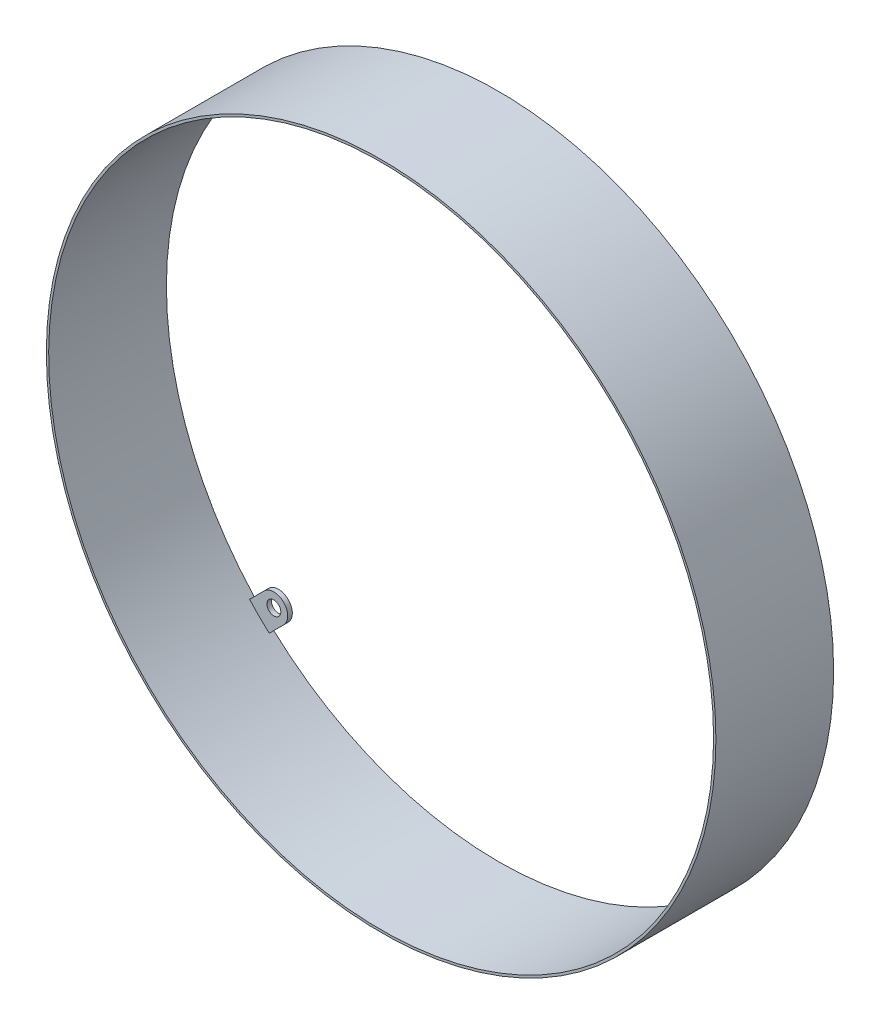
ISO-10303-21;
HEADER;
FILE_DESCRIPTION(('STEP AP214'),'2;1');
FILE_NAME('part.step','',(''),(''),'','','');
FILE_SCHEMA(('AUTOMOTIVE_DESIGN { 1 0 10303 214 1 1 1 1 }'));
ENDSEC;
DATA;
#1=APPLICATION_CONTEXT('core data for automotive mechanical design processes');
#2=APPLICATION_PROTOCOL_DEFINITION('international standard','automotive_design',2000,#1);
#3=PRODUCT_CONTEXT('',#1,'mechanical');
#4=PRODUCT('Part','Part','',(#3));
#5=PRODUCT_RELATED_PRODUCT_CATEGORY('part','',(#4));
#6=PRODUCT_DEFINITION_FORMATION('','',#4);
#7=PRODUCT_DEFINITION_CONTEXT('part definition',#1,'design');
#8=PRODUCT_DEFINITION('design','',#6,#7);
#9=PRODUCT_DEFINITION_SHAPE('','',#8);
#10=(LENGTH_UNIT() NAMED_UNIT(*) SI_UNIT(.MILLI.,.METRE.));
#11=(NAMED_UNIT(*) PLANE_ANGLE_UNIT() SI_UNIT($,.RADIAN.));
#12=(NAMED_UNIT(*) SI_UNIT($,.STERADIAN.) SOLID_ANGLE_UNIT());
#13=UNCERTAINTY_MEASURE_WITH_UNIT(LENGTH_MEASURE(1.E-05),#10,'distance_accuracy_value','');
#14=(GEOMETRIC_REPRESENTATION_CONTEXT(3) GLOBAL_UNCERTAINTY_ASSIGNED_CONTEXT((#13)) GLOBAL_UNIT_ASSIGNED_CONTEXT((#10,
#11,#12)) REPRESENTATION_CONTEXT('',''));
#15=CARTESIAN_POINT('',(0.,0.,0.));
#16=DIRECTION('',(0.,0.,1.));
#17=DIRECTION('',(1.,0.,0.));
#18=AXIS2_PLACEMENT_3D('',#15,#16,#17);
#19=CARTESIAN_POINT('',(0.,0.,25.5));
#20=DIRECTION('',(0.,0.,-1.));
#21=DIRECTION('',(-1.,0.,0.));
#22=AXIS2_PLACEMENT_3D('',#19,#20,#21);
#23=CYLINDRICAL_SURFACE('',#22,72.);
#24=CARTESIAN_POINT('',(0.,0.,25.5));
#25=DIRECTION('',(0.,0.,1.));
#26=DIRECTION('',(1.,0.,0.));
#27=AXIS2_PLACEMENT_3D('',#24,#25,#26);
#28=CIRCLE('',#27,72.);
#29=CARTESIAN_POINT('',(72.,0.,25.5));
#30=VERTEX_POINT('',#29);
#31=EDGE_CURVE('E285',#30,#30,#28,.T.);
#32=ORIENTED_EDGE('',*,*,#31,.T.);
#33=EDGE_LOOP('',(#32));
#34=FACE_BOUND('',#33,.T.);
#35=CARTESIAN_POINT('',(0.,0.,1.));
#36=DIRECTION('',(0.,0.,1.));
#37=DIRECTION('',(1.,0.,0.));
#38=AXIS2_PLACEMENT_3D('',#35,#36,#37);
#39=CIRCLE('',#38,72.);
#40=CARTESIAN_POINT('',(48.7461545298805,-52.9887952169985,1.));
#41=VERTEX_POINT('',#40);
#42=CARTESIAN_POINT('',(52.9887952169998,-48.7461545298792,1.));
#43=VERTEX_POINT('',#42);
#44=EDGE_CURVE('E13',#41,#43,#39,.T.);
#45=ORIENTED_EDGE('',*,*,#44,.F.);
#46=DIRECTION('',(0.,0.,-1.));
#47=VECTOR('',#46,1.);
#48=CARTESIAN_POINT('',(48.7461545298805,-52.9887952169985,25.5));
#49=LINE('',#48,#47);
#50=CARTESIAN_POINT('',(48.7461545298805,-52.9887952169985,0.));
#51=VERTEX_POINT('',#50);
#52=EDGE_CURVE('E169',#41,#51,#49,.T.);
#53=ORIENTED_EDGE('',*,*,#52,.T.);
#54=CARTESIAN_POINT('',(0.,0.,0.));
#55=DIRECTION('',(0.,0.,1.));
#56=DIRECTION('',(1.,0.,0.));
#57=AXIS2_PLACEMENT_3D('',#54,#55,#56);
#58=CIRCLE('',#57,72.);
#59=CARTESIAN_POINT('',(-48.7461545298798,-52.9887952169992,0.));
#60=VERTEX_POINT('',#59);
#61=EDGE_CURVE('E317',#60,#51,#58,.T.);
#62=ORIENTED_EDGE('',*,*,#61,.F.);
#63=DIRECTION('',(0.,0.,-1.));
#64=VECTOR('',#63,1.);
#65=CARTESIAN_POINT('',(-48.7461545298798,-52.9887952169992,25.5));
#66=LINE('',#65,#64);
#67=CARTESIAN_POINT('',(-48.7461545298798,-52.9887952169992,1.));
#68=VERTEX_POINT('',#67);
#69=EDGE_CURVE('E218',#68,#60,#66,.T.);
#70=ORIENTED_EDGE('',*,*,#69,.F.);
#71=CARTESIAN_POINT('',(0.,0.,1.));
#72=DIRECTION('',(0.,0.,1.));
#73=DIRECTION('',(1.,0.,0.));
#74=AXIS2_PLACEMENT_3D('',#71,#72,#73);
#75=CIRCLE('',#74,72.);
#76=CARTESIAN_POINT('',(-52.9887952169991,-48.74615452988,1.));
#77=VERTEX_POINT('',#76);
#78=EDGE_CURVE('E55',#77,#68,#75,.T.);
#79=ORIENTED_EDGE('',*,*,#78,.F.);
#80=DIRECTION('',(0.,0.,-1.));
#81=VECTOR('',#80,1.);
#82=CARTESIAN_POINT('',(-52.9887952169991,-48.74615452988,25.5));
#83=LINE('',#82,#81);
#84=CARTESIAN_POINT('',(-52.9887952169991,-48.74615452988,0.));
#85=VERTEX_POINT('',#84);
#86=EDGE_CURVE('E220',#77,#85,#83,.T.);
#87=ORIENTED_EDGE('',*,*,#86,.T.);
#88=CARTESIAN_POINT('',(-52.9887952169994,48.7461545298796,0.));
#89=VERTEX_POINT('',#88);
#90=EDGE_CURVE('E292',#89,#85,#58,.T.);
#91=ORIENTED_EDGE('',*,*,#90,.F.);
#92=DIRECTION('',(0.,0.,-1.));
#93=VECTOR('',#92,1.);
#94=CARTESIAN_POINT('',(-52.9887952169994,48.7461545298796,25.5));
#95=LINE('',#94,#93);
#96=CARTESIAN_POINT('',(-52.9887952169994,48.7461545298796,1.));
#97=VERTEX_POINT('',#96);
#98=EDGE_CURVE('E250',#97,#89,#95,.T.);
#99=ORIENTED_EDGE('',*,*,#98,.F.);
#100=CARTESIAN_POINT('',(0.,0.,1.));
#101=DIRECTION('',(0.,0.,1.));
#102=DIRECTION('',(1.,0.,0.));
#103=AXIS2_PLACEMENT_3D('',#100,#101,#102);
#104=CIRCLE('',#103,72.);
#105=CARTESIAN_POINT('',(-48.7461545298802,52.9887952169989,1.));
#106=VERTEX_POINT('',#105);
#107=EDGE_CURVE('E306',#106,#97,#104,.T.);
#108=ORIENTED_EDGE('',*,*,#107,.F.);
#109=DIRECTION('',(0.,0.,-1.));
#110=VECTOR('',#109,1.);
#111=CARTESIAN_POINT('',(-48.7461545298802,52.9887952169989,25.5));
#112=LINE('',#111,#110);
#113=CARTESIAN_POINT('',(-48.7461545298802,52.9887952169989,0.));
#114=VERTEX_POINT('',#113);
#115=EDGE_CURVE('E253',#106,#114,#112,.T.);
#116=ORIENTED_EDGE('',*,*,#115,.T.);
#117=CARTESIAN_POINT('',(48.7461545298798,52.9887952169992,0.));
#118=VERTEX_POINT('',#117);
#119=EDGE_CURVE('E289',#118,#114,#58,.T.);
#120=ORIENTED_EDGE('',*,*,#119,.F.);
#121=DIRECTION('',(0.,0.,-1.));
#122=VECTOR('',#121,1.);
#123=CARTESIAN_POINT('',(48.7461545298798,52.9887952169992,25.5));
#124=LINE('',#123,#122);
#125=CARTESIAN_POINT('',(48.7461545298798,52.9887952169992,1.));
#126=VERTEX_POINT('',#125);
#127=EDGE_CURVE('E300',#126,#118,#124,.T.);
#128=ORIENTED_EDGE('',*,*,#127,.F.);
#129=CARTESIAN_POINT('',(0.,0.,1.));
#130=DIRECTION('',(0.,0.,1.));
#131=DIRECTION('',(1.,0.,0.));
#132=AXIS2_PLACEMENT_3D('',#129,#130,#131);
#133=CIRCLE('',#132,72.);
#134=CARTESIAN_POINT('',(52.9887952169991,48.74615452988,1.));
#135=VERTEX_POINT('',#134);
#136=EDGE_CURVE('E296',#135,#126,#133,.T.);
#137=ORIENTED_EDGE('',*,*,#136,.F.);
#138=DIRECTION('',(0.,0.,-1.));
#139=VECTOR('',#138,1.);
#140=CARTESIAN_POINT('',(52.9887952169991,48.74615452988,25.5));
#141=LINE('',#140,#139);
#142=CARTESIAN_POINT('',(52.9887952169991,48.74615452988,0.));
#143=VERTEX_POINT('',#142);
#144=EDGE_CURVE('E303',#135,#143,#141,.T.);
#145=ORIENTED_EDGE('',*,*,#144,.T.);
#146=CARTESIAN_POINT('',(52.9887952169998,-48.7461545298792,0.));
#147=VERTEX_POINT('',#146);
#148=EDGE_CURVE('E284',#147,#143,#58,.T.);
#149=ORIENTED_EDGE('',*,*,#148,.F.);
#150=DIRECTION('',(0.,0.,-1.));
#151=VECTOR('',#150,1.);
#152=CARTESIAN_POINT('',(52.9887952169998,-48.7461545298792,25.5));
#153=LINE('',#152,#151);
#154=EDGE_CURVE('E183',#43,#147,#153,.T.);
#155=ORIENTED_EDGE('',*,*,#154,.F.);
#156=EDGE_LOOP('',(#45,#53,#62,#70,#79,#87,#91,#99,#108,#116,#120,#128,#137,#145,#149,#155));
#157=FACE_BOUND('',#156,.T.);
#158=ADVANCED_FACE('F47',(#34,#157),#23,.F.);
#159=CARTESIAN_POINT('',(0.,0.,25.5));
#160=DIRECTION('',(0.,0.,1.));
#161=DIRECTION('',(1.,0.,0.));
#162=AXIS2_PLACEMENT_3D('',#159,#160,#161);
#163=PLANE('',#162);
#164=CARTESIAN_POINT('',(0.,0.,25.5));
#165=DIRECTION('',(0.,0.,1.));
#166=DIRECTION('',(1.,0.,0.));
#167=AXIS2_PLACEMENT_3D('',#164,#165,#166);
#168=CIRCLE('',#167,72.5);
#169=CARTESIAN_POINT('',(72.5,0.,25.5));
#170=VERTEX_POINT('',#169);
#171=EDGE_CURVE('E293',#170,#170,#168,.T.);
#172=ORIENTED_EDGE('',*,*,#171,.T.);
#173=EDGE_LOOP('',(#172));
#174=FACE_BOUND('',#173,.T.);
#175=ORIENTED_EDGE('',*,*,#31,.F.);
#176=EDGE_LOOP('',(#175));
#177=FACE_BOUND('',#176,.T.);
#178=ADVANCED_FACE('F372',(#174,#177),#163,.T.);
#179=CARTESIAN_POINT('',(0.,0.,0.));
#180=DIRECTION('',(0.,0.,1.));
#181=DIRECTION('',(1.,0.,0.));
#182=AXIS2_PLACEMENT_3D('',#179,#180,#181);
#183=PLANE('',#182);
#184=ORIENTED_EDGE('',*,*,#61,.T.);
#185=DIRECTION('',(0.707106781186558,-0.707106781186537,0.));
#186=VECTOR('',#185,1.);
#187=CARTESIAN_POINT('',(-2.12132034355973,-2.12132034355979,0.));
#188=LINE('',#187,#186);
#189=CARTESIAN_POINT('',(45.6083873865329,-49.851028073651,0.));
#190=VERTEX_POINT('',#189);
#191=EDGE_CURVE('E404',#190,#51,#188,.T.);
#192=ORIENTED_EDGE('',*,*,#191,.F.);
#193=CARTESIAN_POINT('',(47.7297077300926,-47.7297077300914,0.));
#194=DIRECTION('',(0.,0.,1.));
#195=DIRECTION('',(0.,-1.,0.));
#196=AXIS2_PLACEMENT_3D('',#193,#194,#195);
#197=CIRCLE('',#196,3.);
#198=CARTESIAN_POINT('',(49.8510280736522,-45.6083873865317,0.));
#199=VERTEX_POINT('',#198);
#200=EDGE_CURVE('E182',#199,#190,#197,.T.);
#201=ORIENTED_EDGE('',*,*,#200,.F.);
#202=DIRECTION('',(0.707106781186556,-0.707106781186539,0.));
#203=VECTOR('',#202,1.);
#204=CARTESIAN_POINT('',(2.12132034355965,2.1213203435597,0.));
#205=LINE('',#204,#203);
#206=EDGE_CURVE('E62',#199,#147,#205,.T.);
#207=ORIENTED_EDGE('',*,*,#206,.T.);
#208=ORIENTED_EDGE('',*,*,#148,.T.);
#209=DIRECTION('',(0.707106781186544,0.707106781186551,0.));
#210=VECTOR('',#209,1.);
#211=CARTESIAN_POINT('',(2.12132034355977,-2.12132034355975,0.));
#212=LINE('',#211,#210);
#213=CARTESIAN_POINT('',(49.8510280736515,45.6083873865324,0.));
#214=VERTEX_POINT('',#213);
#215=EDGE_CURVE('E273',#214,#143,#212,.T.);
#216=ORIENTED_EDGE('',*,*,#215,.F.);
#217=CARTESIAN_POINT('',(47.7297077300919,47.7297077300921,0.));
#218=DIRECTION('',(0.,0.,1.));
#219=DIRECTION('',(1.,0.,0.));
#220=AXIS2_PLACEMENT_3D('',#217,#218,#219);
#221=CIRCLE('',#220,3.);
#222=CARTESIAN_POINT('',(45.6083873865322,49.8510280736517,0.));
#223=VERTEX_POINT('',#222);
#224=EDGE_CURVE('E256',#223,#214,#221,.T.);
#225=ORIENTED_EDGE('',*,*,#224,.F.);
#226=DIRECTION('',(0.707106781186547,0.707106781186548,0.));
#227=VECTOR('',#226,1.);
#228=CARTESIAN_POINT('',(-2.12132034355968,2.12132034355968,0.));
#229=LINE('',#228,#227);
#230=EDGE_CURVE('E276',#223,#118,#229,.T.);
#231=ORIENTED_EDGE('',*,*,#230,.T.);
#232=ORIENTED_EDGE('',*,*,#119,.T.);
#233=DIRECTION('',(-0.707106781186553,0.707106781186542,0.));
#234=VECTOR('',#233,1.);
#235=CARTESIAN_POINT('',(2.12132034355975,2.12132034355978,0.));
#236=LINE('',#235,#234);
#237=CARTESIAN_POINT('',(-45.6083873865326,49.8510280736514,0.));
#238=VERTEX_POINT('',#237);
#239=EDGE_CURVE('E240',#238,#114,#236,.T.);
#240=ORIENTED_EDGE('',*,*,#239,.F.);
#241=CARTESIAN_POINT('',(-47.7297077300922,47.7297077300917,0.));
#242=DIRECTION('',(0.,0.,1.));
#243=DIRECTION('',(0.,1.,0.));
#244=AXIS2_PLACEMENT_3D('',#241,#242,#243);
#245=CIRCLE('',#244,3.);
#246=CARTESIAN_POINT('',(-49.8510280736518,45.608387386532,0.));
#247=VERTEX_POINT('',#246);
#248=EDGE_CURVE('E223',#247,#238,#245,.T.);
#249=ORIENTED_EDGE('',*,*,#248,.F.);
#250=DIRECTION('',(-0.707106781186551,0.707106781186544,0.));
#251=VECTOR('',#250,1.);
#252=CARTESIAN_POINT('',(-2.12132034355967,-2.12132034355969,0.));
#253=LINE('',#252,#251);
#254=EDGE_CURVE('E242',#247,#89,#253,.T.);
#255=ORIENTED_EDGE('',*,*,#254,.T.);
#256=ORIENTED_EDGE('',*,*,#90,.T.);
#257=DIRECTION('',(-0.707106781186544,-0.707106781186551,0.));
#258=VECTOR('',#257,1.);
#259=CARTESIAN_POINT('',(-2.12132034355977,2.12132034355975,0.));
#260=LINE('',#259,#258);
#261=CARTESIAN_POINT('',(-49.8510280736515,-45.6083873865324,0.));
#262=VERTEX_POINT('',#261);
#263=EDGE_CURVE('E209',#262,#85,#260,.T.);
#264=ORIENTED_EDGE('',*,*,#263,.F.);
#265=CARTESIAN_POINT('',(-47.7297077300919,-47.7297077300921,0.));
#266=DIRECTION('',(0.,0.,1.));
#267=DIRECTION('',(-1.,0.,0.));
#268=AXIS2_PLACEMENT_3D('',#265,#266,#267);
#269=CIRCLE('',#268,3.);
#270=CARTESIAN_POINT('',(-45.6083873865322,-49.8510280736517,0.));
#271=VERTEX_POINT('',#270);
#272=EDGE_CURVE('E192',#271,#262,#269,.T.);
#273=ORIENTED_EDGE('',*,*,#272,.F.);
#274=DIRECTION('',(-0.707106781186547,-0.707106781186548,0.));
#275=VECTOR('',#274,1.);
#276=CARTESIAN_POINT('',(2.12132034355968,-2.12132034355968,0.));
#277=LINE('',#276,#275);
#278=EDGE_CURVE('E69',#271,#60,#277,.T.);
#279=ORIENTED_EDGE('',*,*,#278,.T.);
#280=EDGE_LOOP('',(#184,#192,#201,#207,#208,#216,#225,#231,#232,#240,#249,#255,#256,#264,#273,#279));
#281=FACE_BOUND('',#280,.T.);
#282=CARTESIAN_POINT('',(-47.7297077300919,-47.7297077300921,0.));
#283=DIRECTION('',(0.,0.,1.));
#284=DIRECTION('',(-1.,0.,0.));
#285=AXIS2_PLACEMENT_3D('',#282,#283,#284);
#286=CIRCLE('',#285,1.5);
#287=CARTESIAN_POINT('',(-49.2297077300919,-47.7297077300921,0.));
#288=VERTEX_POINT('',#287);
#289=EDGE_CURVE('E197',#288,#288,#286,.T.);
#290=ORIENTED_EDGE('',*,*,#289,.T.);
#291=EDGE_LOOP('',(#290));
#292=FACE_BOUND('',#291,.T.);
#293=CARTESIAN_POINT('',(0.,0.,0.));
#294=DIRECTION('',(0.,0.,1.));
#295=DIRECTION('',(1.,0.,0.));
#296=AXIS2_PLACEMENT_3D('',#293,#294,#295);
#297=CIRCLE('',#296,72.5);
#298=CARTESIAN_POINT('',(72.5,0.,0.));
#299=VERTEX_POINT('',#298);
#300=EDGE_CURVE('E288',#299,#299,#297,.T.);
#301=ORIENTED_EDGE('',*,*,#300,.F.);
#302=EDGE_LOOP('',(#301));
#303=FACE_BOUND('',#302,.T.);
#304=CARTESIAN_POINT('',(47.7297077300919,47.7297077300921,0.));
#305=DIRECTION('',(0.,0.,1.));
#306=DIRECTION('',(1.,0.,0.));
#307=AXIS2_PLACEMENT_3D('',#304,#305,#306);
#308=CIRCLE('',#307,1.5);
#309=CARTESIAN_POINT('',(49.2297077300919,47.7297077300921,0.));
#310=VERTEX_POINT('',#309);
#311=EDGE_CURVE('E261',#310,#310,#308,.T.);
#312=ORIENTED_EDGE('',*,*,#311,.T.);
#313=EDGE_LOOP('',(#312));
#314=FACE_BOUND('',#313,.T.);
#315=CARTESIAN_POINT('',(-47.7297077300922,47.7297077300917,0.));
#316=DIRECTION('',(0.,0.,1.));
#317=DIRECTION('',(0.,1.,0.));
#318=AXIS2_PLACEMENT_3D('',#315,#316,#317);
#319=CIRCLE('',#318,1.5);
#320=CARTESIAN_POINT('',(-47.7297077300922,49.2297077300917,0.));
#321=VERTEX_POINT('',#320);
#322=EDGE_CURVE('E228',#321,#321,#319,.T.);
#323=ORIENTED_EDGE('',*,*,#322,.T.);
#324=EDGE_LOOP('',(#323));
#325=FACE_BOUND('',#324,.T.);
#326=CARTESIAN_POINT('',(47.7297077300926,-47.7297077300914,0.));
#327=DIRECTION('',(0.,0.,1.));
#328=DIRECTION('',(0.,-1.,0.));
#329=AXIS2_PLACEMENT_3D('',#326,#327,#328);
#330=CIRCLE('',#329,1.5);
#331=CARTESIAN_POINT('',(47.7297077300926,-49.2297077300914,0.));
#332=VERTEX_POINT('',#331);
#333=EDGE_CURVE('E179',#332,#332,#330,.T.);
#334=ORIENTED_EDGE('',*,*,#333,.T.);
#335=EDGE_LOOP('',(#334));
#336=FACE_BOUND('',#335,.T.);
#337=ADVANCED_FACE('F320',(#281,#292,#303,#314,#325,#336),#183,.F.);
#338=CARTESIAN_POINT('',(0.,0.,25.5));
#339=DIRECTION('',(0.,0.,-1.));
#340=DIRECTION('',(-1.,0.,0.));
#341=AXIS2_PLACEMENT_3D('',#338,#339,#340);
#342=CYLINDRICAL_SURFACE('',#341,72.5);
#343=ORIENTED_EDGE('',*,*,#171,.F.);
#344=EDGE_LOOP('',(#343));
#345=FACE_BOUND('',#344,.T.);
#346=ORIENTED_EDGE('',*,*,#300,.T.);
#347=EDGE_LOOP('',(#346));
#348=FACE_BOUND('',#347,.T.);
#349=ADVANCED_FACE('F49',(#345,#348),#342,.T.);
#350=CARTESIAN_POINT('',(0.,0.,1.));
#351=DIRECTION('',(0.,0.,1.));
#352=DIRECTION('',(1.,0.,0.));
#353=AXIS2_PLACEMENT_3D('',#350,#351,#352);
#354=PLANE('',#353);
#355=CARTESIAN_POINT('',(47.7297077300919,47.7297077300921,1.));
#356=DIRECTION('',(0.,0.,1.));
#357=DIRECTION('',(1.,0.,0.));
#358=AXIS2_PLACEMENT_3D('',#355,#356,#357);
#359=CIRCLE('',#358,1.5);
#360=CARTESIAN_POINT('',(49.2297077300919,47.7297077300921,1.));
#361=VERTEX_POINT('',#360);
#362=EDGE_CURVE('E267',#361,#361,#359,.T.);
#363=ORIENTED_EDGE('',*,*,#362,.F.);
#364=EDGE_LOOP('',(#363));
#365=FACE_BOUND('',#364,.T.);
#366=DIRECTION('',(0.707106781186544,0.707106781186551,0.));
#367=VECTOR('',#366,1.);
#368=CARTESIAN_POINT('',(2.12132034355977,-2.12132034355975,1.));
#369=LINE('',#368,#367);
#370=CARTESIAN_POINT('',(49.8510280736515,45.6083873865324,1.));
#371=VERTEX_POINT('',#370);
#372=EDGE_CURVE('E260',#371,#135,#369,.T.);
#373=ORIENTED_EDGE('',*,*,#372,.T.);
#374=ORIENTED_EDGE('',*,*,#136,.T.);
#375=DIRECTION('',(0.707106781186547,0.707106781186548,0.));
#376=VECTOR('',#375,1.);
#377=CARTESIAN_POINT('',(-2.12132034355968,2.12132034355968,1.));
#378=LINE('',#377,#376);
#379=CARTESIAN_POINT('',(45.6083873865322,49.8510280736517,1.));
#380=VERTEX_POINT('',#379);
#381=EDGE_CURVE('E264',#380,#126,#378,.T.);
#382=ORIENTED_EDGE('',*,*,#381,.F.);
#383=CARTESIAN_POINT('',(47.7297077300919,47.7297077300921,1.));
#384=DIRECTION('',(0.,0.,1.));
#385=DIRECTION('',(1.,0.,0.));
#386=AXIS2_PLACEMENT_3D('',#383,#384,#385);
#387=CIRCLE('',#386,3.);
#388=EDGE_CURVE('E257',#380,#371,#387,.T.);
#389=ORIENTED_EDGE('',*,*,#388,.T.);
#390=EDGE_LOOP('',(#373,#374,#382,#389));
#391=FACE_BOUND('',#390,.T.);
#392=ADVANCED_FACE('F332',(#365,#391),#354,.T.);
#393=CARTESIAN_POINT('',(47.7297077300919,47.7297077300921,1.));
#394=DIRECTION('',(0.,0.,-1.));
#395=DIRECTION('',(-1.,0.,0.));
#396=AXIS2_PLACEMENT_3D('',#393,#394,#395);
#397=CYLINDRICAL_SURFACE('',#396,3.);
#398=ORIENTED_EDGE('',*,*,#224,.T.);
#399=DIRECTION('',(0.,0.,-1.));
#400=VECTOR('',#399,1.);
#401=CARTESIAN_POINT('',(49.8510280736515,45.6083873865324,1.));
#402=LINE('',#401,#400);
#403=EDGE_CURVE('E281',#371,#214,#402,.T.);
#404=ORIENTED_EDGE('',*,*,#403,.F.);
#405=ORIENTED_EDGE('',*,*,#388,.F.);
#406=DIRECTION('',(0.,0.,-1.));
#407=VECTOR('',#406,1.);
#408=CARTESIAN_POINT('',(45.6083873865322,49.8510280736517,1.));
#409=LINE('',#408,#407);
#410=EDGE_CURVE('E270',#380,#223,#409,.T.);
#411=ORIENTED_EDGE('',*,*,#410,.T.);
#412=EDGE_LOOP('',(#398,#404,#405,#411));
#413=FACE_BOUND('',#412,.T.);
#414=ADVANCED_FACE('F338',(#413),#397,.T.);
#415=CARTESIAN_POINT('',(2.12132034355977,-2.12132034355975,1.));
#416=DIRECTION('',(-0.707106781186551,0.707106781186544,0.));
#417=DIRECTION('',(-0.707106781186544,-0.707106781186551,0.));
#418=AXIS2_PLACEMENT_3D('',#415,#416,#417);
#419=PLANE('',#418);
#420=ORIENTED_EDGE('',*,*,#144,.F.);
#421=ORIENTED_EDGE('',*,*,#372,.F.);
#422=ORIENTED_EDGE('',*,*,#403,.T.);
#423=ORIENTED_EDGE('',*,*,#215,.T.);
#424=EDGE_LOOP('',(#420,#421,#422,#423));
#425=FACE_BOUND('',#424,.T.);
#426=ADVANCED_FACE('F326',(#425),#419,.F.);
#427=CARTESIAN_POINT('',(-2.12132034355968,2.12132034355968,1.));
#428=DIRECTION('',(-0.707106781186548,0.707106781186547,0.));
#429=DIRECTION('',(-0.707106781186547,-0.707106781186548,0.));
#430=AXIS2_PLACEMENT_3D('',#427,#428,#429);
#431=PLANE('',#430);
#432=ORIENTED_EDGE('',*,*,#381,.T.);
#433=ORIENTED_EDGE('',*,*,#127,.T.);
#434=ORIENTED_EDGE('',*,*,#230,.F.);
#435=ORIENTED_EDGE('',*,*,#410,.F.);
#436=EDGE_LOOP('',(#432,#433,#434,#435));
#437=FACE_BOUND('',#436,.T.);
#438=ADVANCED_FACE('F334',(#437),#431,.T.);
#439=CARTESIAN_POINT('',(47.7297077300919,47.7297077300921,1.));
#440=DIRECTION('',(0.,0.,-1.));
#441=DIRECTION('',(-1.,0.,0.));
#442=AXIS2_PLACEMENT_3D('',#439,#440,#441);
#443=CYLINDRICAL_SURFACE('',#442,1.5);
#444=ORIENTED_EDGE('',*,*,#362,.T.);
#445=EDGE_LOOP('',(#444));
#446=FACE_BOUND('',#445,.T.);
#447=ORIENTED_EDGE('',*,*,#311,.F.);
#448=EDGE_LOOP('',(#447));
#449=FACE_BOUND('',#448,.T.);
#450=ADVANCED_FACE('F533',(#446,#449),#443,.F.);
#451=CARTESIAN_POINT('',(0.,0.,1.));
#452=DIRECTION('',(0.,0.,1.));
#453=DIRECTION('',(0.,1.,0.));
#454=AXIS2_PLACEMENT_3D('',#451,#452,#453);
#455=PLANE('',#454);
#456=CARTESIAN_POINT('',(-47.7297077300922,47.7297077300917,1.));
#457=DIRECTION('',(0.,0.,1.));
#458=DIRECTION('',(0.,1.,0.));
#459=AXIS2_PLACEMENT_3D('',#456,#457,#458);
#460=CIRCLE('',#459,1.5);
#461=CARTESIAN_POINT('',(-47.7297077300922,49.2297077300917,1.));
#462=VERTEX_POINT('',#461);
#463=EDGE_CURVE('E234',#462,#462,#460,.T.);
#464=ORIENTED_EDGE('',*,*,#463,.F.);
#465=EDGE_LOOP('',(#464));
#466=FACE_BOUND('',#465,.T.);
#467=DIRECTION('',(-0.707106781186553,0.707106781186542,0.));
#468=VECTOR('',#467,1.);
#469=CARTESIAN_POINT('',(2.12132034355975,2.12132034355978,1.));
#470=LINE('',#469,#468);
#471=CARTESIAN_POINT('',(-45.6083873865326,49.8510280736514,1.));
#472=VERTEX_POINT('',#471);
#473=EDGE_CURVE('E227',#472,#106,#470,.T.);
#474=ORIENTED_EDGE('',*,*,#473,.T.);
#475=ORIENTED_EDGE('',*,*,#107,.T.);
#476=DIRECTION('',(-0.707106781186551,0.707106781186544,0.));
#477=VECTOR('',#476,1.);
#478=CARTESIAN_POINT('',(-2.12132034355967,-2.12132034355969,1.));
#479=LINE('',#478,#477);
#480=CARTESIAN_POINT('',(-49.8510280736518,45.608387386532,1.));
#481=VERTEX_POINT('',#480);
#482=EDGE_CURVE('E231',#481,#97,#479,.T.);
#483=ORIENTED_EDGE('',*,*,#482,.F.);
#484=CARTESIAN_POINT('',(-47.7297077300922,47.7297077300917,1.));
#485=DIRECTION('',(0.,0.,1.));
#486=DIRECTION('',(0.,1.,0.));
#487=AXIS2_PLACEMENT_3D('',#484,#485,#486);
#488=CIRCLE('',#487,3.);
#489=EDGE_CURVE('E224',#481,#472,#488,.T.);
#490=ORIENTED_EDGE('',*,*,#489,.T.);
#491=EDGE_LOOP('',(#474,#475,#483,#490));
#492=FACE_BOUND('',#491,.T.);
#493=ADVANCED_FACE('F345',(#466,#492),#455,.T.);
#494=CARTESIAN_POINT('',(-47.7297077300922,47.7297077300917,1.));
#495=DIRECTION('',(0.,0.,-1.));
#496=DIRECTION('',(-1.,0.,0.));
#497=AXIS2_PLACEMENT_3D('',#494,#495,#496);
#498=CYLINDRICAL_SURFACE('',#497,3.);
#499=ORIENTED_EDGE('',*,*,#248,.T.);
#500=DIRECTION('',(0.,0.,-1.));
#501=VECTOR('',#500,1.);
#502=CARTESIAN_POINT('',(-45.6083873865326,49.8510280736514,1.));
#503=LINE('',#502,#501);
#504=EDGE_CURVE('E247',#472,#238,#503,.T.);
#505=ORIENTED_EDGE('',*,*,#504,.F.);
#506=ORIENTED_EDGE('',*,*,#489,.F.);
#507=DIRECTION('',(0.,0.,-1.));
#508=VECTOR('',#507,1.);
#509=CARTESIAN_POINT('',(-49.8510280736518,45.608387386532,1.));
#510=LINE('',#509,#508);
#511=EDGE_CURVE('E237',#481,#247,#510,.T.);
#512=ORIENTED_EDGE('',*,*,#511,.T.);
#513=EDGE_LOOP('',(#499,#505,#506,#512));
#514=FACE_BOUND('',#513,.T.);
#515=ADVANCED_FACE('F350',(#514),#498,.T.);
#516=CARTESIAN_POINT('',(2.12132034355975,2.12132034355978,1.));
#517=DIRECTION('',(-0.707106781186542,-0.707106781186553,0.));
#518=DIRECTION('',(0.707106781186553,-0.707106781186542,0.));
#519=AXIS2_PLACEMENT_3D('',#516,#517,#518);
#520=PLANE('',#519);
#521=ORIENTED_EDGE('',*,*,#115,.F.);
#522=ORIENTED_EDGE('',*,*,#473,.F.);
#523=ORIENTED_EDGE('',*,*,#504,.T.);
#524=ORIENTED_EDGE('',*,*,#239,.T.);
#525=EDGE_LOOP('',(#521,#522,#523,#524));
#526=FACE_BOUND('',#525,.T.);
#527=ADVANCED_FACE('F343',(#526),#520,.F.);
#528=CARTESIAN_POINT('',(-2.12132034355967,-2.12132034355969,1.));
#529=DIRECTION('',(-0.707106781186544,-0.707106781186551,0.));
#530=DIRECTION('',(0.707106781186551,-0.707106781186544,0.));
#531=AXIS2_PLACEMENT_3D('',#528,#529,#530);
#532=PLANE('',#531);
#533=ORIENTED_EDGE('',*,*,#482,.T.);
#534=ORIENTED_EDGE('',*,*,#98,.T.);
#535=ORIENTED_EDGE('',*,*,#254,.F.);
#536=ORIENTED_EDGE('',*,*,#511,.F.);
#537=EDGE_LOOP('',(#533,#534,#535,#536));
#538=FACE_BOUND('',#537,.T.);
#539=ADVANCED_FACE('F353',(#538),#532,.T.);
#540=CARTESIAN_POINT('',(-47.7297077300922,47.7297077300917,1.));
#541=DIRECTION('',(0.,0.,-1.));
#542=DIRECTION('',(-1.,0.,0.));
#543=AXIS2_PLACEMENT_3D('',#540,#541,#542);
#544=CYLINDRICAL_SURFACE('',#543,1.5);
#545=ORIENTED_EDGE('',*,*,#463,.T.);
#546=EDGE_LOOP('',(#545));
#547=FACE_BOUND('',#546,.T.);
#548=ORIENTED_EDGE('',*,*,#322,.F.);
#549=EDGE_LOOP('',(#548));
#550=FACE_BOUND('',#549,.T.);
#551=ADVANCED_FACE('F367',(#547,#550),#544,.F.);
#552=CARTESIAN_POINT('',(0.,0.,1.));
#553=DIRECTION('',(0.,0.,1.));
#554=DIRECTION('',(-1.,0.,0.));
#555=AXIS2_PLACEMENT_3D('',#552,#553,#554);
#556=PLANE('',#555);
#557=CARTESIAN_POINT('',(-47.7297077300919,-47.7297077300921,1.));
#558=DIRECTION('',(0.,0.,1.));
#559=DIRECTION('',(-1.,0.,0.));
#560=AXIS2_PLACEMENT_3D('',#557,#558,#559);
#561=CIRCLE('',#560,1.5);
#562=CARTESIAN_POINT('',(-49.2297077300919,-47.7297077300921,1.));
#563=VERTEX_POINT('',#562);
#564=EDGE_CURVE('E203',#563,#563,#561,.T.);
#565=ORIENTED_EDGE('',*,*,#564,.F.);
#566=EDGE_LOOP('',(#565));
#567=FACE_BOUND('',#566,.T.);
#568=DIRECTION('',(-0.707106781186544,-0.707106781186551,0.));
#569=VECTOR('',#568,1.);
#570=CARTESIAN_POINT('',(-2.12132034355977,2.12132034355975,1.));
#571=LINE('',#570,#569);
#572=CARTESIAN_POINT('',(-49.8510280736515,-45.6083873865324,1.));
#573=VERTEX_POINT('',#572);
#574=EDGE_CURVE('E196',#573,#77,#571,.T.);
#575=ORIENTED_EDGE('',*,*,#574,.T.);
#576=ORIENTED_EDGE('',*,*,#78,.T.);
#577=DIRECTION('',(-0.707106781186547,-0.707106781186548,0.));
#578=VECTOR('',#577,1.);
#579=CARTESIAN_POINT('',(2.12132034355968,-2.12132034355968,1.));
#580=LINE('',#579,#578);
#581=CARTESIAN_POINT('',(-45.6083873865322,-49.8510280736517,1.));
#582=VERTEX_POINT('',#581);
#583=EDGE_CURVE('E200',#582,#68,#580,.T.);
#584=ORIENTED_EDGE('',*,*,#583,.F.);
#585=CARTESIAN_POINT('',(-47.7297077300919,-47.7297077300921,1.));
#586=DIRECTION('',(0.,0.,1.));
#587=DIRECTION('',(-1.,0.,0.));
#588=AXIS2_PLACEMENT_3D('',#585,#586,#587);
#589=CIRCLE('',#588,3.);
#590=EDGE_CURVE('E193',#582,#573,#589,.T.);
#591=ORIENTED_EDGE('',*,*,#590,.T.);
#592=EDGE_LOOP('',(#575,#576,#584,#591));
#593=FACE_BOUND('',#592,.T.);
#594=ADVANCED_FACE('F309',(#567,#593),#556,.T.);
#595=CARTESIAN_POINT('',(-47.7297077300919,-47.7297077300921,1.));
#596=DIRECTION('',(0.,0.,-1.));
#597=DIRECTION('',(-1.,0.,0.));
#598=AXIS2_PLACEMENT_3D('',#595,#596,#597);
#599=CYLINDRICAL_SURFACE('',#598,3.);
#600=ORIENTED_EDGE('',*,*,#272,.T.);
#601=DIRECTION('',(0.,0.,-1.));
#602=VECTOR('',#601,1.);
#603=CARTESIAN_POINT('',(-49.8510280736515,-45.6083873865324,1.));
#604=LINE('',#603,#602);
#605=EDGE_CURVE('E215',#573,#262,#604,.T.);
#606=ORIENTED_EDGE('',*,*,#605,.F.);
#607=ORIENTED_EDGE('',*,*,#590,.F.);
#608=DIRECTION('',(0.,0.,-1.));
#609=VECTOR('',#608,1.);
#610=CARTESIAN_POINT('',(-45.6083873865322,-49.8510280736517,1.));
#611=LINE('',#610,#609);
#612=EDGE_CURVE('E206',#582,#271,#611,.T.);
#613=ORIENTED_EDGE('',*,*,#612,.T.);
#614=EDGE_LOOP('',(#600,#606,#607,#613));
#615=FACE_BOUND('',#614,.T.);
#616=ADVANCED_FACE('F359',(#615),#599,.T.);
#617=CARTESIAN_POINT('',(-2.12132034355977,2.12132034355975,1.));
#618=DIRECTION('',(0.707106781186551,-0.707106781186544,0.));
#619=DIRECTION('',(0.707106781186544,0.707106781186551,0.));
#620=AXIS2_PLACEMENT_3D('',#617,#618,#619);
#621=PLANE('',#620);
#622=ORIENTED_EDGE('',*,*,#86,.F.);
#623=ORIENTED_EDGE('',*,*,#574,.F.);
#624=ORIENTED_EDGE('',*,*,#605,.T.);
#625=ORIENTED_EDGE('',*,*,#263,.T.);
#626=EDGE_LOOP('',(#622,#623,#624,#625));
#627=FACE_BOUND('',#626,.T.);
#628=ADVANCED_FACE('F357',(#627),#621,.F.);
#629=CARTESIAN_POINT('',(2.12132034355968,-2.12132034355968,1.));
#630=DIRECTION('',(0.707106781186548,-0.707106781186547,0.));
#631=DIRECTION('',(0.707106781186547,0.707106781186548,0.));
#632=AXIS2_PLACEMENT_3D('',#629,#630,#631);
#633=PLANE('',#632);
#634=ORIENTED_EDGE('',*,*,#583,.T.);
#635=ORIENTED_EDGE('',*,*,#69,.T.);
#636=ORIENTED_EDGE('',*,*,#278,.F.);
#637=ORIENTED_EDGE('',*,*,#612,.F.);
#638=EDGE_LOOP('',(#634,#635,#636,#637));
#639=FACE_BOUND('',#638,.T.);
#640=ADVANCED_FACE('F314',(#639),#633,.T.);
#641=CARTESIAN_POINT('',(-47.7297077300919,-47.7297077300921,1.));
#642=DIRECTION('',(0.,0.,-1.));
#643=DIRECTION('',(-1.,0.,0.));
#644=AXIS2_PLACEMENT_3D('',#641,#642,#643);
#645=CYLINDRICAL_SURFACE('',#644,1.5);
#646=ORIENTED_EDGE('',*,*,#564,.T.);
#647=EDGE_LOOP('',(#646));
#648=FACE_BOUND('',#647,.T.);
#649=ORIENTED_EDGE('',*,*,#289,.F.);
#650=EDGE_LOOP('',(#649));
#651=FACE_BOUND('',#650,.T.);
#652=ADVANCED_FACE('F427',(#648,#651),#645,.F.);
#653=CARTESIAN_POINT('',(0.,0.,1.));
#654=DIRECTION('',(0.,0.,1.));
#655=DIRECTION('',(0.,-1.,0.));
#656=AXIS2_PLACEMENT_3D('',#653,#654,#655);
#657=PLANE('',#656);
#658=CARTESIAN_POINT('',(47.7297077300926,-47.7297077300914,1.));
#659=DIRECTION('',(0.,0.,1.));
#660=DIRECTION('',(0.,-1.,0.));
#661=AXIS2_PLACEMENT_3D('',#658,#659,#660);
#662=CIRCLE('',#661,1.5);
#663=CARTESIAN_POINT('',(47.7297077300926,-49.2297077300914,1.));
#664=VERTEX_POINT('',#663);
#665=EDGE_CURVE('E187',#664,#664,#662,.T.);
#666=ORIENTED_EDGE('',*,*,#665,.F.);
#667=EDGE_LOOP('',(#666));
#668=FACE_BOUND('',#667,.T.);
#669=DIRECTION('',(0.707106781186558,-0.707106781186537,0.));
#670=VECTOR('',#669,1.);
#671=CARTESIAN_POINT('',(-2.12132034355973,-2.12132034355979,1.));
#672=LINE('',#671,#670);
#673=CARTESIAN_POINT('',(45.6083873865329,-49.851028073651,1.));
#674=VERTEX_POINT('',#673);
#675=EDGE_CURVE('E162',#674,#41,#672,.T.);
#676=ORIENTED_EDGE('',*,*,#675,.T.);
#677=ORIENTED_EDGE('',*,*,#44,.T.);
#678=DIRECTION('',(0.707106781186556,-0.707106781186539,0.));
#679=VECTOR('',#678,1.);
#680=CARTESIAN_POINT('',(2.12132034355965,2.1213203435597,1.));
#681=LINE('',#680,#679);
#682=CARTESIAN_POINT('',(49.8510280736522,-45.6083873865317,1.));
#683=VERTEX_POINT('',#682);
#684=EDGE_CURVE('E171',#683,#43,#681,.T.);
#685=ORIENTED_EDGE('',*,*,#684,.F.);
#686=CARTESIAN_POINT('',(47.7297077300926,-47.7297077300914,1.));
#687=DIRECTION('',(0.,0.,1.));
#688=DIRECTION('',(0.,-1.,0.));
#689=AXIS2_PLACEMENT_3D('',#686,#687,#688);
#690=CIRCLE('',#689,3.);
#691=EDGE_CURVE('E172',#683,#674,#690,.T.);
#692=ORIENTED_EDGE('',*,*,#691,.T.);
#693=EDGE_LOOP('',(#676,#677,#685,#692));
#694=FACE_BOUND('',#693,.T.);
#695=ADVANCED_FACE('F176',(#668,#694),#657,.T.);
#696=CARTESIAN_POINT('',(47.7297077300926,-47.7297077300914,1.));
#697=DIRECTION('',(0.,0.,-1.));
#698=DIRECTION('',(-1.,0.,0.));
#699=AXIS2_PLACEMENT_3D('',#696,#697,#698);
#700=CYLINDRICAL_SURFACE('',#699,3.);
#701=ORIENTED_EDGE('',*,*,#200,.T.);
#702=DIRECTION('',(0.,0.,-1.));
#703=VECTOR('',#702,1.);
#704=CARTESIAN_POINT('',(45.6083873865329,-49.851028073651,1.));
#705=LINE('',#704,#703);
#706=EDGE_CURVE('E166',#674,#190,#705,.T.);
#707=ORIENTED_EDGE('',*,*,#706,.F.);
#708=ORIENTED_EDGE('',*,*,#691,.F.);
#709=DIRECTION('',(0.,0.,-1.));
#710=VECTOR('',#709,1.);
#711=CARTESIAN_POINT('',(49.8510280736522,-45.6083873865317,1.));
#712=LINE('',#711,#710);
#713=EDGE_CURVE('E184',#683,#199,#712,.T.);
#714=ORIENTED_EDGE('',*,*,#713,.T.);
#715=EDGE_LOOP('',(#701,#707,#708,#714));
#716=FACE_BOUND('',#715,.T.);
#717=ADVANCED_FACE('F181',(#716),#700,.T.);
#718=CARTESIAN_POINT('',(-2.12132034355973,-2.12132034355979,1.));
#719=DIRECTION('',(0.707106781186537,0.707106781186558,0.));
#720=DIRECTION('',(-0.707106781186558,0.707106781186537,0.));
#721=AXIS2_PLACEMENT_3D('',#718,#719,#720);
#722=PLANE('',#721);
#723=ORIENTED_EDGE('',*,*,#52,.F.);
#724=ORIENTED_EDGE('',*,*,#675,.F.);
#725=ORIENTED_EDGE('',*,*,#706,.T.);
#726=ORIENTED_EDGE('',*,*,#191,.T.);
#727=EDGE_LOOP('',(#723,#724,#725,#726));
#728=FACE_BOUND('',#727,.T.);
#729=ADVANCED_FACE('F164',(#728),#722,.F.);
#730=CARTESIAN_POINT('',(2.12132034355965,2.1213203435597,1.));
#731=DIRECTION('',(0.707106781186539,0.707106781186556,0.));
#732=DIRECTION('',(-0.707106781186556,0.707106781186539,0.));
#733=AXIS2_PLACEMENT_3D('',#730,#731,#732);
#734=PLANE('',#733);
#735=ORIENTED_EDGE('',*,*,#684,.T.);
#736=ORIENTED_EDGE('',*,*,#154,.T.);
#737=ORIENTED_EDGE('',*,*,#206,.F.);
#738=ORIENTED_EDGE('',*,*,#713,.F.);
#739=EDGE_LOOP('',(#735,#736,#737,#738));
#740=FACE_BOUND('',#739,.T.);
#741=ADVANCED_FACE('F412',(#740),#734,.T.);
#742=CARTESIAN_POINT('',(47.7297077300926,-47.7297077300914,1.));
#743=DIRECTION('',(0.,0.,-1.));
#744=DIRECTION('',(-1.,0.,0.));
#745=AXIS2_PLACEMENT_3D('',#742,#743,#744);
#746=CYLINDRICAL_SURFACE('',#745,1.5);
#747=ORIENTED_EDGE('',*,*,#665,.T.);
#748=EDGE_LOOP('',(#747));
#749=FACE_BOUND('',#748,.T.);
#750=ORIENTED_EDGE('',*,*,#333,.F.);
#751=EDGE_LOOP('',(#750));
#752=FACE_BOUND('',#751,.T.);
#753=ADVANCED_FACE('F414',(#749,#752),#746,.F.);
#754=CLOSED_SHELL('',(#158,#178,#337,#349,#392,#414,#426,#438,#450,#493,#515,#527,#539,#551,
#594,#616,#628,#640,#652,#695,#717,#729,#741,#753));
#755=MANIFOLD_SOLID_BREP('B2',#754);
#756=ADVANCED_BREP_SHAPE_REPRESENTATION('',(#18,#755),#14);
#757=SHAPE_DEFINITION_REPRESENTATION(#9,#756);
ENDSEC;
END-ISO-10303-21;
